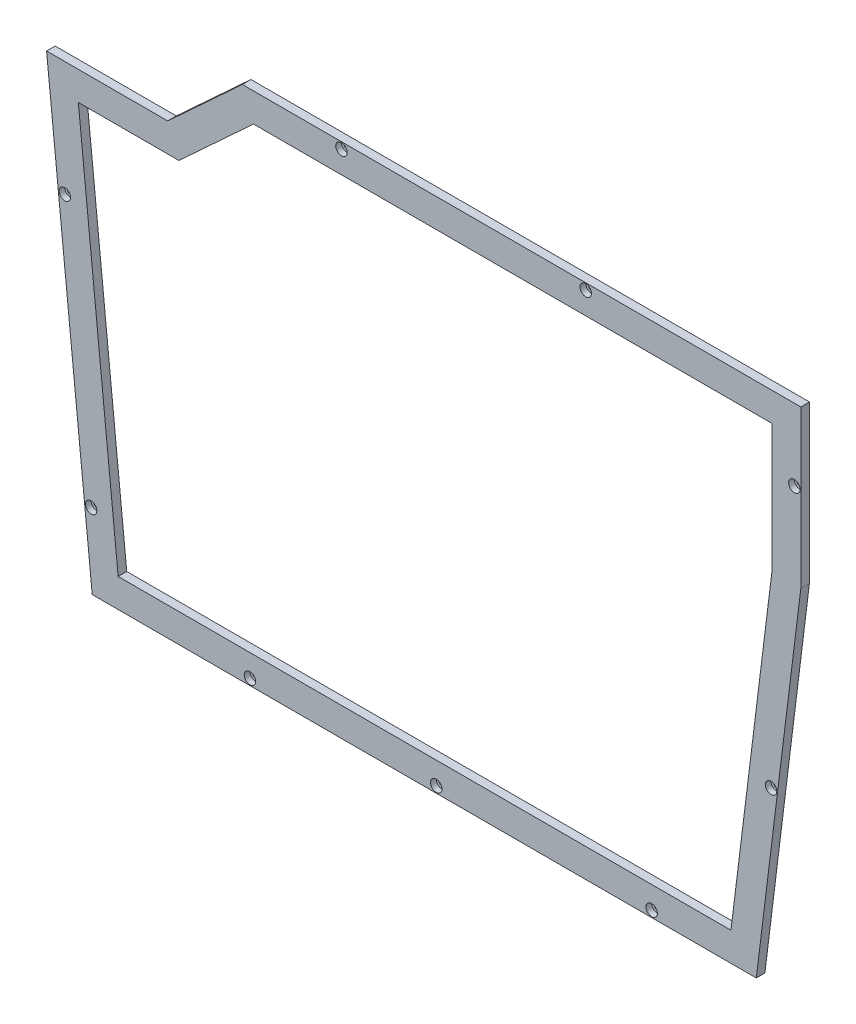
ISO-10303-21;
HEADER;
FILE_DESCRIPTION(('STEP AP214'),'2;1');
FILE_NAME('part.step','',(''),(''),'','','');
FILE_SCHEMA(('AUTOMOTIVE_DESIGN { 1 0 10303 214 1 1 1 1 }'));
ENDSEC;
DATA;
#1=APPLICATION_CONTEXT('core data for automotive mechanical design processes');
#2=APPLICATION_PROTOCOL_DEFINITION('international standard','automotive_design',2000,#1);
#3=PRODUCT_CONTEXT('',#1,'mechanical');
#4=PRODUCT('Part','Part','',(#3));
#5=PRODUCT_RELATED_PRODUCT_CATEGORY('part','',(#4));
#6=PRODUCT_DEFINITION_FORMATION('','',#4);
#7=PRODUCT_DEFINITION_CONTEXT('part definition',#1,'design');
#8=PRODUCT_DEFINITION('design','',#6,#7);
#9=PRODUCT_DEFINITION_SHAPE('','',#8);
#10=(LENGTH_UNIT() NAMED_UNIT(*) SI_UNIT(.MILLI.,.METRE.));
#11=(NAMED_UNIT(*) PLANE_ANGLE_UNIT() SI_UNIT($,.RADIAN.));
#12=(NAMED_UNIT(*) SI_UNIT($,.STERADIAN.) SOLID_ANGLE_UNIT());
#13=UNCERTAINTY_MEASURE_WITH_UNIT(LENGTH_MEASURE(1.E-05),#10,'distance_accuracy_value','');
#14=(GEOMETRIC_REPRESENTATION_CONTEXT(3) GLOBAL_UNCERTAINTY_ASSIGNED_CONTEXT((#13)) GLOBAL_UNIT_ASSIGNED_CONTEXT((#10,
#11,#12)) REPRESENTATION_CONTEXT('',''));
#15=CARTESIAN_POINT('',(0.,0.,0.));
#16=DIRECTION('',(0.,0.,1.));
#17=DIRECTION('',(1.,0.,0.));
#18=AXIS2_PLACEMENT_3D('',#15,#16,#17);
#19=CARTESIAN_POINT('',(0.,0.,6.));
#20=DIRECTION('',(0.,0.,-1.));
#21=DIRECTION('',(-1.,0.,0.));
#22=AXIS2_PLACEMENT_3D('',#19,#20,#21);
#23=PLANE('',#22);
#24=CARTESIAN_POINT('',(1.72669205479839,-145.122614110825,6.));
#25=DIRECTION('',(0.,0.,1.));
#26=DIRECTION('',(1.,0.,0.));
#27=AXIS2_PLACEMENT_3D('',#24,#25,#26);
#28=CIRCLE('',#27,3.99999999999999);
#29=CARTESIAN_POINT('',(5.72669205479838,-145.122614110825,6.));
#30=VERTEX_POINT('',#29);
#31=EDGE_CURVE('E643',#30,#30,#28,.T.);
#32=ORIENTED_EDGE('',*,*,#31,.F.);
#33=EDGE_LOOP('',(#32));
#34=FACE_BOUND('',#33,.T.);
#35=CARTESIAN_POINT('',(20.0680254489332,-325.051094707287,6.));
#36=DIRECTION('',(0.,0.,1.));
#37=DIRECTION('',(1.,0.,0.));
#38=AXIS2_PLACEMENT_3D('',#35,#36,#37);
#39=CIRCLE('',#38,3.99999999999999);
#40=CARTESIAN_POINT('',(24.0680254489332,-325.051094707287,6.));
#41=VERTEX_POINT('',#40);
#42=EDGE_CURVE('E289',#41,#41,#39,.T.);
#43=ORIENTED_EDGE('',*,*,#42,.F.);
#44=EDGE_LOOP('',(#43));
#45=FACE_BOUND('',#44,.T.);
#46=CARTESIAN_POINT('',(130.819543847785,-372.8,6.));
#47=DIRECTION('',(0.,0.,1.));
#48=DIRECTION('',(1.,0.,0.));
#49=AXIS2_PLACEMENT_3D('',#46,#47,#48);
#50=CIRCLE('',#49,4.);
#51=CARTESIAN_POINT('',(134.819543847785,-372.8,6.));
#52=VERTEX_POINT('',#51);
#53=EDGE_CURVE('E276',#52,#52,#50,.T.);
#54=ORIENTED_EDGE('',*,*,#53,.F.);
#55=EDGE_LOOP('',(#54));
#56=FACE_BOUND('',#55,.T.);
#57=CARTESIAN_POINT('',(260.695946351952,-372.8,6.));
#58=DIRECTION('',(0.,0.,1.));
#59=DIRECTION('',(1.,0.,0.));
#60=AXIS2_PLACEMENT_3D('',#57,#58,#59);
#61=CIRCLE('',#60,4.);
#62=CARTESIAN_POINT('',(264.695946351952,-372.8,6.));
#63=VERTEX_POINT('',#62);
#64=EDGE_CURVE('E272',#63,#63,#61,.T.);
#65=ORIENTED_EDGE('',*,*,#64,.F.);
#66=EDGE_LOOP('',(#65));
#67=FACE_BOUND('',#66,.T.);
#68=CARTESIAN_POINT('',(410.870792038076,-372.8,6.));
#69=DIRECTION('',(0.,0.,1.));
#70=DIRECTION('',(1.,0.,0.));
#71=AXIS2_PLACEMENT_3D('',#68,#69,#70);
#72=CIRCLE('',#71,4.);
#73=CARTESIAN_POINT('',(414.870792038076,-372.8,6.));
#74=VERTEX_POINT('',#73);
#75=EDGE_CURVE('E268',#74,#74,#72,.T.);
#76=ORIENTED_EDGE('',*,*,#75,.F.);
#77=EDGE_LOOP('',(#76));
#78=FACE_BOUND('',#77,.T.);
#79=CARTESIAN_POINT('',(494.109580684271,-257.391480805223,6.));
#80=DIRECTION('',(0.,0.,1.));
#81=DIRECTION('',(1.,0.,0.));
#82=AXIS2_PLACEMENT_3D('',#79,#80,#81);
#83=CIRCLE('',#82,4.);
#84=CARTESIAN_POINT('',(498.109580684271,-257.391480805223,6.));
#85=VERTEX_POINT('',#84);
#86=EDGE_CURVE('E263',#85,#85,#83,.T.);
#87=ORIENTED_EDGE('',*,*,#86,.F.);
#88=EDGE_LOOP('',(#87));
#89=FACE_BOUND('',#88,.T.);
#90=CARTESIAN_POINT('',(510.343252999998,-67.0320824467655,6.));
#91=DIRECTION('',(0.,0.,1.));
#92=DIRECTION('',(1.,0.,0.));
#93=AXIS2_PLACEMENT_3D('',#90,#91,#92);
#94=CIRCLE('',#93,4.);
#95=CARTESIAN_POINT('',(514.343252999998,-67.0320824467655,6.));
#96=VERTEX_POINT('',#95);
#97=EDGE_CURVE('E258',#96,#96,#94,.T.);
#98=ORIENTED_EDGE('',*,*,#97,.F.);
#99=EDGE_LOOP('',(#98));
#100=FACE_BOUND('',#99,.T.);
#101=CARTESIAN_POINT('',(364.912339867024,-21.5,6.));
#102=DIRECTION('',(0.,0.,1.));
#103=DIRECTION('',(1.,0.,0.));
#104=AXIS2_PLACEMENT_3D('',#101,#102,#103);
#105=CIRCLE('',#104,4.);
#106=CARTESIAN_POINT('',(368.912339867024,-21.5,6.));
#107=VERTEX_POINT('',#106);
#108=EDGE_CURVE('E253',#107,#107,#105,.T.);
#109=ORIENTED_EDGE('',*,*,#108,.F.);
#110=EDGE_LOOP('',(#109));
#111=FACE_BOUND('',#110,.T.);
#112=CARTESIAN_POINT('',(194.606610563881,-21.5,6.));
#113=DIRECTION('',(0.,0.,1.));
#114=DIRECTION('',(1.,0.,0.));
#115=AXIS2_PLACEMENT_3D('',#112,#113,#114);
#116=CIRCLE('',#115,4.);
#117=CARTESIAN_POINT('',(198.606610563881,-21.5,6.));
#118=VERTEX_POINT('',#117);
#119=EDGE_CURVE('E248',#118,#118,#116,.T.);
#120=ORIENTED_EDGE('',*,*,#119,.F.);
#121=EDGE_LOOP('',(#120));
#122=FACE_BOUND('',#121,.T.);
#123=DIRECTION('',(-1.,0.,0.));
#124=VECTOR('',#123,1.);
#125=CARTESIAN_POINT('',(73.4811454902829,-64.9999999999999,6.));
#126=LINE('',#125,#124);
#127=CARTESIAN_POINT('',(73.4811454902829,-64.9999999999999,6.));
#128=VERTEX_POINT('',#127);
#129=CARTESIAN_POINT('',(-10.9640703472468,-64.9999999999999,6.));
#130=VERTEX_POINT('',#129);
#131=EDGE_CURVE('E196',#128,#130,#126,.T.);
#132=ORIENTED_EDGE('',*,*,#131,.T.);
#133=DIRECTION('',(0.101411272958268,-0.994844587720607,0.));
#134=VECTOR('',#133,1.);
#135=CARTESIAN_POINT('',(-10.9640703472468,-64.9999999999999,6.));
#136=LINE('',#135,#134);
#137=CARTESIAN_POINT('',(20.8707920380743,-377.3,6.));
#138=VERTEX_POINT('',#137);
#139=EDGE_CURVE('E199',#130,#138,#136,.T.);
#140=ORIENTED_EDGE('',*,*,#139,.T.);
#141=DIRECTION('',(1.,0.,0.));
#142=VECTOR('',#141,1.);
#143=CARTESIAN_POINT('',(20.8707920380743,-377.3,6.));
#144=LINE('',#143,#142);
#145=CARTESIAN_POINT('',(483.797653512222,-377.3,6.));
#146=VERTEX_POINT('',#145);
#147=EDGE_CURVE('E202',#138,#146,#144,.T.);
#148=ORIENTED_EDGE('',*,*,#147,.T.);
#149=DIRECTION('',(0.12287521201879,0.992422129071766,0.));
#150=VECTOR('',#149,1.);
#151=CARTESIAN_POINT('',(483.797653512222,-377.3,6.));
#152=LINE('',#151,#150);
#153=CARTESIAN_POINT('',(514.843252999998,-126.555041470395,6.));
#154=VERTEX_POINT('',#153);
#155=EDGE_CURVE('E204',#146,#154,#152,.T.);
#156=ORIENTED_EDGE('',*,*,#155,.T.);
#157=DIRECTION('',(0.,1.,0.));
#158=VECTOR('',#157,1.);
#159=CARTESIAN_POINT('',(514.843252999998,-126.555041470395,6.));
#160=LINE('',#159,#158);
#161=CARTESIAN_POINT('',(514.843252999998,-17.,6.));
#162=VERTEX_POINT('',#161);
#163=EDGE_CURVE('E206',#154,#162,#160,.T.);
#164=ORIENTED_EDGE('',*,*,#163,.T.);
#165=DIRECTION('',(-1.,0.,0.));
#166=VECTOR('',#165,1.);
#167=CARTESIAN_POINT('',(514.843252999998,-17.,6.));
#168=LINE('',#167,#166);
#169=CARTESIAN_POINT('',(125.481145490283,-17.,6.));
#170=VERTEX_POINT('',#169);
#171=EDGE_CURVE('E208',#162,#170,#168,.T.);
#172=ORIENTED_EDGE('',*,*,#171,.T.);
#173=DIRECTION('',(-0.734803444627488,-0.678280102733065,0.));
#174=VECTOR('',#173,1.);
#175=CARTESIAN_POINT('',(125.481145490283,-17.,6.));
#176=LINE('',#175,#174);
#177=EDGE_CURVE('E210',#170,#128,#176,.T.);
#178=ORIENTED_EDGE('',*,*,#177,.T.);
#179=EDGE_LOOP('',(#132,#140,#148,#156,#164,#172,#178));
#180=FACE_BOUND('',#179,.T.);
#181=DIRECTION('',(-1.,0.,0.));
#182=VECTOR('',#181,1.);
#183=CARTESIAN_POINT('',(81.3008221785398,-84.9999999999999,6.));
#184=LINE('',#183,#182);
#185=CARTESIAN_POINT('',(81.3008221785398,-84.9999999999999,6.));
#186=VERTEX_POINT('',#185);
#187=CARTESIAN_POINT('',(11.1783082021873,-84.9999999999999,6.));
#188=VERTEX_POINT('',#187);
#189=EDGE_CURVE('E136',#186,#188,#184,.T.);
#190=ORIENTED_EDGE('',*,*,#189,.F.);
#191=DIRECTION('',(-0.734803444627488,-0.678280102733065,0.));
#192=VECTOR('',#191,1.);
#193=CARTESIAN_POINT('',(133.30082217854,-37.,6.));
#194=LINE('',#193,#192);
#195=CARTESIAN_POINT('',(133.30082217854,-37.,6.));
#196=VERTEX_POINT('',#195);
#197=EDGE_CURVE('E168',#196,#186,#194,.T.);
#198=ORIENTED_EDGE('',*,*,#197,.F.);
#199=DIRECTION('',(-1.,0.,0.));
#200=VECTOR('',#199,1.);
#201=CARTESIAN_POINT('',(494.843252999998,-37.,6.));
#202=LINE('',#201,#200);
#203=CARTESIAN_POINT('',(494.843252999998,-37.,6.));
#204=VERTEX_POINT('',#203);
#205=EDGE_CURVE('E166',#204,#196,#202,.T.);
#206=ORIENTED_EDGE('',*,*,#205,.F.);
#207=DIRECTION('',(0.,1.,0.));
#208=VECTOR('',#207,1.);
#209=CARTESIAN_POINT('',(494.843252999998,-125.321615980626,6.));
#210=LINE('',#209,#208);
#211=CARTESIAN_POINT('',(494.843252999998,-125.321615980626,6.));
#212=VERTEX_POINT('',#211);
#213=EDGE_CURVE('E164',#212,#204,#210,.T.);
#214=ORIENTED_EDGE('',*,*,#213,.F.);
#215=DIRECTION('',(0.12287521201879,0.992422129071766,0.));
#216=VECTOR('',#215,1.);
#217=CARTESIAN_POINT('',(466.121207929502,-357.3,6.));
#218=LINE('',#217,#216);
#219=CARTESIAN_POINT('',(466.121207929502,-357.3,6.));
#220=VERTEX_POINT('',#219);
#221=EDGE_CURVE('E159',#220,#212,#218,.T.);
#222=ORIENTED_EDGE('',*,*,#221,.F.);
#223=DIRECTION('',(1.,0.,0.));
#224=VECTOR('',#223,1.);
#225=CARTESIAN_POINT('',(38.9356986201281,-357.3,6.));
#226=LINE('',#225,#224);
#227=CARTESIAN_POINT('',(38.9356986201281,-357.3,6.));
#228=VERTEX_POINT('',#227);
#229=EDGE_CURVE('E157',#228,#220,#226,.T.);
#230=ORIENTED_EDGE('',*,*,#229,.F.);
#231=DIRECTION('',(0.101411272958268,-0.994844587720606,0.));
#232=VECTOR('',#231,1.);
#233=CARTESIAN_POINT('',(11.1783082021873,-84.9999999999999,6.));
#234=LINE('',#233,#232);
#235=EDGE_CURVE('E144',#188,#228,#234,.T.);
#236=ORIENTED_EDGE('',*,*,#235,.F.);
#237=EDGE_LOOP('',(#190,#198,#206,#214,#222,#230,#236));
#238=FACE_BOUND('',#237,.T.);
#239=ADVANCED_FACE('F33',(#34,#45,#56,#67,#78,#89,#100,#111,#122,#180,#238),#23,.F.);
#240=CARTESIAN_POINT('',(0.,0.,0.));
#241=DIRECTION('',(0.,0.,-1.));
#242=DIRECTION('',(-1.,0.,0.));
#243=AXIS2_PLACEMENT_3D('',#240,#241,#242);
#244=PLANE('',#243);
#245=CARTESIAN_POINT('',(1.72669205479839,-145.122614110825,0.));
#246=DIRECTION('',(0.,0.,-1.));
#247=DIRECTION('',(-1.,0.,0.));
#248=AXIS2_PLACEMENT_3D('',#245,#246,#247);
#249=CIRCLE('',#248,2.15);
#250=CARTESIAN_POINT('',(-0.42330794520161,-145.122614110825,0.));
#251=VERTEX_POINT('',#250);
#252=EDGE_CURVE('E37',#251,#251,#249,.T.);
#253=ORIENTED_EDGE('',*,*,#252,.F.);
#254=EDGE_LOOP('',(#253));
#255=FACE_BOUND('',#254,.T.);
#256=CARTESIAN_POINT('',(20.0680254489332,-325.051094707287,0.));
#257=DIRECTION('',(0.,0.,-1.));
#258=DIRECTION('',(-1.,0.,0.));
#259=AXIS2_PLACEMENT_3D('',#256,#257,#258);
#260=CIRCLE('',#259,2.15);
#261=CARTESIAN_POINT('',(17.9180254489332,-325.051094707287,0.));
#262=VERTEX_POINT('',#261);
#263=EDGE_CURVE('E274',#262,#262,#260,.T.);
#264=ORIENTED_EDGE('',*,*,#263,.F.);
#265=EDGE_LOOP('',(#264));
#266=FACE_BOUND('',#265,.T.);
#267=CARTESIAN_POINT('',(130.819543847785,-372.8,0.));
#268=DIRECTION('',(0.,0.,-1.));
#269=DIRECTION('',(-1.,0.,0.));
#270=AXIS2_PLACEMENT_3D('',#267,#268,#269);
#271=CIRCLE('',#270,2.15);
#272=CARTESIAN_POINT('',(128.669543847785,-372.8,0.));
#273=VERTEX_POINT('',#272);
#274=EDGE_CURVE('E270',#273,#273,#271,.T.);
#275=ORIENTED_EDGE('',*,*,#274,.F.);
#276=EDGE_LOOP('',(#275));
#277=FACE_BOUND('',#276,.T.);
#278=CARTESIAN_POINT('',(260.695946351952,-372.8,0.));
#279=DIRECTION('',(0.,0.,-1.));
#280=DIRECTION('',(-1.,0.,0.));
#281=AXIS2_PLACEMENT_3D('',#278,#279,#280);
#282=CIRCLE('',#281,2.14999999999999);
#283=CARTESIAN_POINT('',(258.545946351952,-372.8,0.));
#284=VERTEX_POINT('',#283);
#285=EDGE_CURVE('E265',#284,#284,#282,.T.);
#286=ORIENTED_EDGE('',*,*,#285,.F.);
#287=EDGE_LOOP('',(#286));
#288=FACE_BOUND('',#287,.T.);
#289=CARTESIAN_POINT('',(410.870792038076,-372.8,0.));
#290=DIRECTION('',(0.,0.,-1.));
#291=DIRECTION('',(-1.,0.,0.));
#292=AXIS2_PLACEMENT_3D('',#289,#290,#291);
#293=CIRCLE('',#292,2.14999999999999);
#294=CARTESIAN_POINT('',(408.720792038076,-372.8,0.));
#295=VERTEX_POINT('',#294);
#296=EDGE_CURVE('E260',#295,#295,#293,.T.);
#297=ORIENTED_EDGE('',*,*,#296,.F.);
#298=EDGE_LOOP('',(#297));
#299=FACE_BOUND('',#298,.T.);
#300=CARTESIAN_POINT('',(494.109580684271,-257.391480805223,0.));
#301=DIRECTION('',(0.,0.,-1.));
#302=DIRECTION('',(-1.,0.,0.));
#303=AXIS2_PLACEMENT_3D('',#300,#301,#302);
#304=CIRCLE('',#303,2.14999999999999);
#305=CARTESIAN_POINT('',(491.959580684271,-257.391480805223,0.));
#306=VERTEX_POINT('',#305);
#307=EDGE_CURVE('E255',#306,#306,#304,.T.);
#308=ORIENTED_EDGE('',*,*,#307,.F.);
#309=EDGE_LOOP('',(#308));
#310=FACE_BOUND('',#309,.T.);
#311=CARTESIAN_POINT('',(510.343252999998,-67.0320824467655,0.));
#312=DIRECTION('',(0.,0.,-1.));
#313=DIRECTION('',(-1.,0.,0.));
#314=AXIS2_PLACEMENT_3D('',#311,#312,#313);
#315=CIRCLE('',#314,2.14999999999999);
#316=CARTESIAN_POINT('',(508.193252999998,-67.0320824467655,0.));
#317=VERTEX_POINT('',#316);
#318=EDGE_CURVE('E250',#317,#317,#315,.T.);
#319=ORIENTED_EDGE('',*,*,#318,.F.);
#320=EDGE_LOOP('',(#319));
#321=FACE_BOUND('',#320,.T.);
#322=CARTESIAN_POINT('',(364.912339867024,-21.5,0.));
#323=DIRECTION('',(0.,0.,-1.));
#324=DIRECTION('',(-1.,0.,0.));
#325=AXIS2_PLACEMENT_3D('',#322,#323,#324);
#326=CIRCLE('',#325,2.14999999999999);
#327=CARTESIAN_POINT('',(362.762339867024,-21.5,0.));
#328=VERTEX_POINT('',#327);
#329=EDGE_CURVE('E245',#328,#328,#326,.T.);
#330=ORIENTED_EDGE('',*,*,#329,.F.);
#331=EDGE_LOOP('',(#330));
#332=FACE_BOUND('',#331,.T.);
#333=CARTESIAN_POINT('',(194.606610563881,-21.5,0.));
#334=DIRECTION('',(0.,0.,-1.));
#335=DIRECTION('',(-1.,0.,0.));
#336=AXIS2_PLACEMENT_3D('',#333,#334,#335);
#337=CIRCLE('',#336,2.15);
#338=CARTESIAN_POINT('',(192.456610563881,-21.5,0.));
#339=VERTEX_POINT('',#338);
#340=EDGE_CURVE('E171',#339,#339,#337,.T.);
#341=ORIENTED_EDGE('',*,*,#340,.F.);
#342=EDGE_LOOP('',(#341));
#343=FACE_BOUND('',#342,.T.);
#344=DIRECTION('',(-1.,0.,0.));
#345=VECTOR('',#344,1.);
#346=CARTESIAN_POINT('',(73.4811454902829,-64.9999999999999,0.));
#347=LINE('',#346,#345);
#348=CARTESIAN_POINT('',(73.4811454902829,-64.9999999999999,0.));
#349=VERTEX_POINT('',#348);
#350=CARTESIAN_POINT('',(-10.9640703472468,-64.9999999999999,0.));
#351=VERTEX_POINT('',#350);
#352=EDGE_CURVE('E152',#349,#351,#347,.T.);
#353=ORIENTED_EDGE('',*,*,#352,.F.);
#354=DIRECTION('',(-0.734803444627488,-0.678280102733065,0.));
#355=VECTOR('',#354,1.);
#356=CARTESIAN_POINT('',(125.481145490283,-17.,0.));
#357=LINE('',#356,#355);
#358=CARTESIAN_POINT('',(125.481145490283,-17.,0.));
#359=VERTEX_POINT('',#358);
#360=EDGE_CURVE('E200',#359,#349,#357,.T.);
#361=ORIENTED_EDGE('',*,*,#360,.F.);
#362=DIRECTION('',(-1.,0.,0.));
#363=VECTOR('',#362,1.);
#364=CARTESIAN_POINT('',(514.843252999998,-17.,0.));
#365=LINE('',#364,#363);
#366=CARTESIAN_POINT('',(514.843252999998,-17.,0.));
#367=VERTEX_POINT('',#366);
#368=EDGE_CURVE('E223',#367,#359,#365,.T.);
#369=ORIENTED_EDGE('',*,*,#368,.F.);
#370=DIRECTION('',(0.,1.,0.));
#371=VECTOR('',#370,1.);
#372=CARTESIAN_POINT('',(514.843252999998,-126.555041470395,0.));
#373=LINE('',#372,#371);
#374=CARTESIAN_POINT('',(514.843252999998,-126.555041470395,0.));
#375=VERTEX_POINT('',#374);
#376=EDGE_CURVE('E221',#375,#367,#373,.T.);
#377=ORIENTED_EDGE('',*,*,#376,.F.);
#378=DIRECTION('',(0.12287521201879,0.992422129071766,0.));
#379=VECTOR('',#378,1.);
#380=CARTESIAN_POINT('',(483.797653512222,-377.3,0.));
#381=LINE('',#380,#379);
#382=CARTESIAN_POINT('',(483.797653512222,-377.3,0.));
#383=VERTEX_POINT('',#382);
#384=EDGE_CURVE('E219',#383,#375,#381,.T.);
#385=ORIENTED_EDGE('',*,*,#384,.F.);
#386=DIRECTION('',(1.,0.,0.));
#387=VECTOR('',#386,1.);
#388=CARTESIAN_POINT('',(20.8707920380743,-377.3,0.));
#389=LINE('',#388,#387);
#390=CARTESIAN_POINT('',(20.8707920380743,-377.3,0.));
#391=VERTEX_POINT('',#390);
#392=EDGE_CURVE('E217',#391,#383,#389,.T.);
#393=ORIENTED_EDGE('',*,*,#392,.F.);
#394=DIRECTION('',(0.101411272958268,-0.994844587720607,0.));
#395=VECTOR('',#394,1.);
#396=CARTESIAN_POINT('',(-10.9640703472468,-64.9999999999999,0.));
#397=LINE('',#396,#395);
#398=EDGE_CURVE('E215',#351,#391,#397,.T.);
#399=ORIENTED_EDGE('',*,*,#398,.F.);
#400=EDGE_LOOP('',(#353,#361,#369,#377,#385,#393,#399));
#401=FACE_BOUND('',#400,.T.);
#402=DIRECTION('',(-0.734803444627488,-0.678280102733065,0.));
#403=VECTOR('',#402,1.);
#404=CARTESIAN_POINT('',(133.30082217854,-37.,0.));
#405=LINE('',#404,#403);
#406=CARTESIAN_POINT('',(133.30082217854,-37.,0.));
#407=VERTEX_POINT('',#406);
#408=CARTESIAN_POINT('',(81.3008221785398,-84.9999999999999,0.));
#409=VERTEX_POINT('',#408);
#410=EDGE_CURVE('E145',#407,#409,#405,.T.);
#411=ORIENTED_EDGE('',*,*,#410,.T.);
#412=DIRECTION('',(-1.,0.,0.));
#413=VECTOR('',#412,1.);
#414=CARTESIAN_POINT('',(81.3008221785398,-84.9999999999999,0.));
#415=LINE('',#414,#413);
#416=CARTESIAN_POINT('',(11.1783082021873,-84.9999999999999,0.));
#417=VERTEX_POINT('',#416);
#418=EDGE_CURVE('E58',#409,#417,#415,.T.);
#419=ORIENTED_EDGE('',*,*,#418,.T.);
#420=DIRECTION('',(0.101411272958268,-0.994844587720606,0.));
#421=VECTOR('',#420,1.);
#422=CARTESIAN_POINT('',(11.1783082021873,-84.9999999999999,0.));
#423=LINE('',#422,#421);
#424=CARTESIAN_POINT('',(38.9356986201281,-357.3,0.));
#425=VERTEX_POINT('',#424);
#426=EDGE_CURVE('E151',#417,#425,#423,.T.);
#427=ORIENTED_EDGE('',*,*,#426,.T.);
#428=DIRECTION('',(1.,0.,0.));
#429=VECTOR('',#428,1.);
#430=CARTESIAN_POINT('',(38.9356986201281,-357.3,0.));
#431=LINE('',#430,#429);
#432=CARTESIAN_POINT('',(466.121207929502,-357.3,0.));
#433=VERTEX_POINT('',#432);
#434=EDGE_CURVE('E173',#425,#433,#431,.T.);
#435=ORIENTED_EDGE('',*,*,#434,.T.);
#436=DIRECTION('',(0.12287521201879,0.992422129071766,0.));
#437=VECTOR('',#436,1.);
#438=CARTESIAN_POINT('',(466.121207929502,-357.3,0.));
#439=LINE('',#438,#437);
#440=CARTESIAN_POINT('',(494.843252999998,-125.321615980626,0.));
#441=VERTEX_POINT('',#440);
#442=EDGE_CURVE('E176',#433,#441,#439,.T.);
#443=ORIENTED_EDGE('',*,*,#442,.T.);
#444=DIRECTION('',(0.,1.,0.));
#445=VECTOR('',#444,1.);
#446=CARTESIAN_POINT('',(494.843252999998,-125.321615980626,0.));
#447=LINE('',#446,#445);
#448=CARTESIAN_POINT('',(494.843252999998,-37.,0.));
#449=VERTEX_POINT('',#448);
#450=EDGE_CURVE('E179',#441,#449,#447,.T.);
#451=ORIENTED_EDGE('',*,*,#450,.T.);
#452=DIRECTION('',(-1.,0.,0.));
#453=VECTOR('',#452,1.);
#454=CARTESIAN_POINT('',(494.843252999998,-37.,0.));
#455=LINE('',#454,#453);
#456=EDGE_CURVE('E182',#449,#407,#455,.T.);
#457=ORIENTED_EDGE('',*,*,#456,.T.);
#458=EDGE_LOOP('',(#411,#419,#427,#435,#443,#451,#457));
#459=FACE_BOUND('',#458,.T.);
#460=ADVANCED_FACE('F356',(#255,#266,#277,#288,#299,#310,#321,#332,#343,#401,#459),#244,.T.);
#461=CARTESIAN_POINT('',(73.4811454902829,-64.9999999999999,6.));
#462=DIRECTION('',(0.,-1.,0.));
#463=DIRECTION('',(1.,0.,0.));
#464=AXIS2_PLACEMENT_3D('',#461,#462,#463);
#465=PLANE('',#464);
#466=ORIENTED_EDGE('',*,*,#352,.T.);
#467=DIRECTION('',(0.,0.,-1.));
#468=VECTOR('',#467,1.);
#469=CARTESIAN_POINT('',(-10.9640703472468,-64.9999999999999,6.));
#470=LINE('',#469,#468);
#471=EDGE_CURVE('E11',#130,#351,#470,.T.);
#472=ORIENTED_EDGE('',*,*,#471,.F.);
#473=ORIENTED_EDGE('',*,*,#131,.F.);
#474=DIRECTION('',(0.,0.,-1.));
#475=VECTOR('',#474,1.);
#476=CARTESIAN_POINT('',(73.4811454902829,-64.9999999999999,6.));
#477=LINE('',#476,#475);
#478=EDGE_CURVE('E212',#128,#349,#477,.T.);
#479=ORIENTED_EDGE('',*,*,#478,.T.);
#480=EDGE_LOOP('',(#466,#472,#473,#479));
#481=FACE_BOUND('',#480,.T.);
#482=ADVANCED_FACE('F35',(#481),#465,.F.);
#483=CARTESIAN_POINT('',(-10.9640703472468,-64.9999999999999,6.));
#484=DIRECTION('',(0.994844587720606,0.101411272958268,0.));
#485=DIRECTION('',(-0.101411272958268,0.994844587720607,0.));
#486=AXIS2_PLACEMENT_3D('',#483,#484,#485);
#487=PLANE('',#486);
#488=ORIENTED_EDGE('',*,*,#398,.T.);
#489=DIRECTION('',(0.,0.,-1.));
#490=VECTOR('',#489,1.);
#491=CARTESIAN_POINT('',(20.8707920380743,-377.3,6.));
#492=LINE('',#491,#490);
#493=EDGE_CURVE('E42',#138,#391,#492,.T.);
#494=ORIENTED_EDGE('',*,*,#493,.F.);
#495=ORIENTED_EDGE('',*,*,#139,.F.);
#496=ORIENTED_EDGE('',*,*,#471,.T.);
#497=EDGE_LOOP('',(#488,#494,#495,#496));
#498=FACE_BOUND('',#497,.T.);
#499=ADVANCED_FACE('F367',(#498),#487,.F.);
#500=CARTESIAN_POINT('',(20.8707920380743,-377.3,6.));
#501=DIRECTION('',(0.,1.,0.));
#502=DIRECTION('',(-1.,0.,0.));
#503=AXIS2_PLACEMENT_3D('',#500,#501,#502);
#504=PLANE('',#503);
#505=ORIENTED_EDGE('',*,*,#392,.T.);
#506=DIRECTION('',(0.,0.,-1.));
#507=VECTOR('',#506,1.);
#508=CARTESIAN_POINT('',(483.797653512222,-377.3,6.));
#509=LINE('',#508,#507);
#510=EDGE_CURVE('E237',#146,#383,#509,.T.);
#511=ORIENTED_EDGE('',*,*,#510,.F.);
#512=ORIENTED_EDGE('',*,*,#147,.F.);
#513=ORIENTED_EDGE('',*,*,#493,.T.);
#514=EDGE_LOOP('',(#505,#511,#512,#513));
#515=FACE_BOUND('',#514,.T.);
#516=ADVANCED_FACE('F372',(#515),#504,.F.);
#517=CARTESIAN_POINT('',(483.797653512222,-377.3,6.));
#518=DIRECTION('',(-0.992422129071766,0.12287521201879,0.));
#519=DIRECTION('',(-0.12287521201879,-0.992422129071766,0.));
#520=AXIS2_PLACEMENT_3D('',#517,#518,#519);
#521=PLANE('',#520);
#522=ORIENTED_EDGE('',*,*,#384,.T.);
#523=DIRECTION('',(0.,0.,-1.));
#524=VECTOR('',#523,1.);
#525=CARTESIAN_POINT('',(514.843252999998,-126.555041470395,6.));
#526=LINE('',#525,#524);
#527=EDGE_CURVE('E234',#154,#375,#526,.T.);
#528=ORIENTED_EDGE('',*,*,#527,.F.);
#529=ORIENTED_EDGE('',*,*,#155,.F.);
#530=ORIENTED_EDGE('',*,*,#510,.T.);
#531=EDGE_LOOP('',(#522,#528,#529,#530));
#532=FACE_BOUND('',#531,.T.);
#533=ADVANCED_FACE('F378',(#532),#521,.F.);
#534=CARTESIAN_POINT('',(514.843252999998,-126.555041470395,6.));
#535=DIRECTION('',(-1.,0.,0.));
#536=DIRECTION('',(0.,0.,1.));
#537=AXIS2_PLACEMENT_3D('',#534,#535,#536);
#538=PLANE('',#537);
#539=ORIENTED_EDGE('',*,*,#376,.T.);
#540=DIRECTION('',(0.,0.,-1.));
#541=VECTOR('',#540,1.);
#542=CARTESIAN_POINT('',(514.843252999998,-17.,6.));
#543=LINE('',#542,#541);
#544=EDGE_CURVE('E231',#162,#367,#543,.T.);
#545=ORIENTED_EDGE('',*,*,#544,.F.);
#546=ORIENTED_EDGE('',*,*,#163,.F.);
#547=ORIENTED_EDGE('',*,*,#527,.T.);
#548=EDGE_LOOP('',(#539,#545,#546,#547));
#549=FACE_BOUND('',#548,.T.);
#550=ADVANCED_FACE('F382',(#549),#538,.F.);
#551=CARTESIAN_POINT('',(514.843252999998,-17.,6.));
#552=DIRECTION('',(0.,-1.,0.));
#553=DIRECTION('',(1.,0.,0.));
#554=AXIS2_PLACEMENT_3D('',#551,#552,#553);
#555=PLANE('',#554);
#556=ORIENTED_EDGE('',*,*,#368,.T.);
#557=DIRECTION('',(0.,0.,-1.));
#558=VECTOR('',#557,1.);
#559=CARTESIAN_POINT('',(125.481145490283,-17.,6.));
#560=LINE('',#559,#558);
#561=EDGE_CURVE('E228',#170,#359,#560,.T.);
#562=ORIENTED_EDGE('',*,*,#561,.F.);
#563=ORIENTED_EDGE('',*,*,#171,.F.);
#564=ORIENTED_EDGE('',*,*,#544,.T.);
#565=EDGE_LOOP('',(#556,#562,#563,#564));
#566=FACE_BOUND('',#565,.T.);
#567=ADVANCED_FACE('F387',(#566),#555,.F.);
#568=CARTESIAN_POINT('',(125.481145490283,-17.,6.));
#569=DIRECTION('',(0.678280102733065,-0.734803444627488,0.));
#570=DIRECTION('',(0.734803444627488,0.678280102733065,0.));
#571=AXIS2_PLACEMENT_3D('',#568,#569,#570);
#572=PLANE('',#571);
#573=ORIENTED_EDGE('',*,*,#360,.T.);
#574=ORIENTED_EDGE('',*,*,#478,.F.);
#575=ORIENTED_EDGE('',*,*,#177,.F.);
#576=ORIENTED_EDGE('',*,*,#561,.T.);
#577=EDGE_LOOP('',(#573,#574,#575,#576));
#578=FACE_BOUND('',#577,.T.);
#579=ADVANCED_FACE('F390',(#578),#572,.F.);
#580=CARTESIAN_POINT('',(81.3008221785398,-84.9999999999999,6.));
#581=DIRECTION('',(0.,-1.,0.));
#582=DIRECTION('',(1.,0.,0.));
#583=AXIS2_PLACEMENT_3D('',#580,#581,#582);
#584=PLANE('',#583);
#585=ORIENTED_EDGE('',*,*,#418,.F.);
#586=DIRECTION('',(0.,0.,-1.));
#587=VECTOR('',#586,1.);
#588=CARTESIAN_POINT('',(81.3008221785398,-84.9999999999999,6.));
#589=LINE('',#588,#587);
#590=EDGE_CURVE('E140',#186,#409,#589,.T.);
#591=ORIENTED_EDGE('',*,*,#590,.F.);
#592=ORIENTED_EDGE('',*,*,#189,.T.);
#593=DIRECTION('',(0.,0.,-1.));
#594=VECTOR('',#593,1.);
#595=CARTESIAN_POINT('',(11.1783082021873,-84.9999999999999,6.));
#596=LINE('',#595,#594);
#597=EDGE_CURVE('E139',#188,#417,#596,.T.);
#598=ORIENTED_EDGE('',*,*,#597,.T.);
#599=EDGE_LOOP('',(#585,#591,#592,#598));
#600=FACE_BOUND('',#599,.T.);
#601=ADVANCED_FACE('F138',(#600),#584,.T.);
#602=CARTESIAN_POINT('',(11.1783082021873,-84.9999999999999,6.));
#603=DIRECTION('',(0.994844587720607,0.101411272958268,0.));
#604=DIRECTION('',(-0.101411272958268,0.994844587720607,0.));
#605=AXIS2_PLACEMENT_3D('',#602,#603,#604);
#606=PLANE('',#605);
#607=ORIENTED_EDGE('',*,*,#426,.F.);
#608=ORIENTED_EDGE('',*,*,#597,.F.);
#609=ORIENTED_EDGE('',*,*,#235,.T.);
#610=DIRECTION('',(0.,0.,-1.));
#611=VECTOR('',#610,1.);
#612=CARTESIAN_POINT('',(38.9356986201281,-357.3,6.));
#613=LINE('',#612,#611);
#614=EDGE_CURVE('E153',#228,#425,#613,.T.);
#615=ORIENTED_EDGE('',*,*,#614,.T.);
#616=EDGE_LOOP('',(#607,#608,#609,#615));
#617=FACE_BOUND('',#616,.T.);
#618=ADVANCED_FACE('F148',(#617),#606,.T.);
#619=CARTESIAN_POINT('',(38.9356986201281,-357.3,6.));
#620=DIRECTION('',(0.,1.,0.));
#621=DIRECTION('',(-1.,0.,0.));
#622=AXIS2_PLACEMENT_3D('',#619,#620,#621);
#623=PLANE('',#622);
#624=ORIENTED_EDGE('',*,*,#434,.F.);
#625=ORIENTED_EDGE('',*,*,#614,.F.);
#626=ORIENTED_EDGE('',*,*,#229,.T.);
#627=DIRECTION('',(0.,0.,-1.));
#628=VECTOR('',#627,1.);
#629=CARTESIAN_POINT('',(466.121207929502,-357.3,6.));
#630=LINE('',#629,#628);
#631=EDGE_CURVE('E193',#220,#433,#630,.T.);
#632=ORIENTED_EDGE('',*,*,#631,.T.);
#633=EDGE_LOOP('',(#624,#625,#626,#632));
#634=FACE_BOUND('',#633,.T.);
#635=ADVANCED_FACE('F413',(#634),#623,.T.);
#636=CARTESIAN_POINT('',(466.121207929502,-357.3,6.));
#637=DIRECTION('',(-0.992422129071766,0.12287521201879,0.));
#638=DIRECTION('',(-0.12287521201879,-0.992422129071766,0.));
#639=AXIS2_PLACEMENT_3D('',#636,#637,#638);
#640=PLANE('',#639);
#641=ORIENTED_EDGE('',*,*,#442,.F.);
#642=ORIENTED_EDGE('',*,*,#631,.F.);
#643=ORIENTED_EDGE('',*,*,#221,.T.);
#644=DIRECTION('',(0.,0.,-1.));
#645=VECTOR('',#644,1.);
#646=CARTESIAN_POINT('',(494.843252999998,-125.321615980626,6.));
#647=LINE('',#646,#645);
#648=EDGE_CURVE('E191',#212,#441,#647,.T.);
#649=ORIENTED_EDGE('',*,*,#648,.T.);
#650=EDGE_LOOP('',(#641,#642,#643,#649));
#651=FACE_BOUND('',#650,.T.);
#652=ADVANCED_FACE('F409',(#651),#640,.T.);
#653=CARTESIAN_POINT('',(494.843252999998,-125.321615980626,6.));
#654=DIRECTION('',(-1.,0.,0.));
#655=DIRECTION('',(0.,0.,1.));
#656=AXIS2_PLACEMENT_3D('',#653,#654,#655);
#657=PLANE('',#656);
#658=ORIENTED_EDGE('',*,*,#450,.F.);
#659=ORIENTED_EDGE('',*,*,#648,.F.);
#660=ORIENTED_EDGE('',*,*,#213,.T.);
#661=DIRECTION('',(0.,0.,-1.));
#662=VECTOR('',#661,1.);
#663=CARTESIAN_POINT('',(494.843252999998,-37.,6.));
#664=LINE('',#663,#662);
#665=EDGE_CURVE('E189',#204,#449,#664,.T.);
#666=ORIENTED_EDGE('',*,*,#665,.T.);
#667=EDGE_LOOP('',(#658,#659,#660,#666));
#668=FACE_BOUND('',#667,.T.);
#669=ADVANCED_FACE('F405',(#668),#657,.T.);
#670=CARTESIAN_POINT('',(494.843252999998,-37.,6.));
#671=DIRECTION('',(0.,-1.,0.));
#672=DIRECTION('',(1.,0.,0.));
#673=AXIS2_PLACEMENT_3D('',#670,#671,#672);
#674=PLANE('',#673);
#675=ORIENTED_EDGE('',*,*,#456,.F.);
#676=ORIENTED_EDGE('',*,*,#665,.F.);
#677=ORIENTED_EDGE('',*,*,#205,.T.);
#678=DIRECTION('',(0.,0.,-1.));
#679=VECTOR('',#678,1.);
#680=CARTESIAN_POINT('',(133.30082217854,-37.,6.));
#681=LINE('',#680,#679);
#682=EDGE_CURVE('E50',#196,#407,#681,.T.);
#683=ORIENTED_EDGE('',*,*,#682,.T.);
#684=EDGE_LOOP('',(#675,#676,#677,#683));
#685=FACE_BOUND('',#684,.T.);
#686=ADVANCED_FACE('F402',(#685),#674,.T.);
#687=CARTESIAN_POINT('',(133.30082217854,-37.,6.));
#688=DIRECTION('',(0.678280102733065,-0.734803444627488,0.));
#689=DIRECTION('',(0.734803444627488,0.678280102733065,0.));
#690=AXIS2_PLACEMENT_3D('',#687,#688,#689);
#691=PLANE('',#690);
#692=ORIENTED_EDGE('',*,*,#410,.F.);
#693=ORIENTED_EDGE('',*,*,#682,.F.);
#694=ORIENTED_EDGE('',*,*,#197,.T.);
#695=ORIENTED_EDGE('',*,*,#590,.T.);
#696=EDGE_LOOP('',(#692,#693,#694,#695));
#697=FACE_BOUND('',#696,.T.);
#698=ADVANCED_FACE('F397',(#697),#691,.T.);
#699=CARTESIAN_POINT('',(194.606610563881,-21.5,6.));
#700=DIRECTION('',(0.,0.,1.));
#701=DIRECTION('',(1.,0.,0.));
#702=AXIS2_PLACEMENT_3D('',#699,#700,#701);
#703=CYLINDRICAL_SURFACE('',#702,2.15);
#704=ORIENTED_EDGE('',*,*,#340,.T.);
#705=EDGE_LOOP('',(#704));
#706=FACE_BOUND('',#705,.T.);
#707=CARTESIAN_POINT('',(194.606610563881,-21.5,2.));
#708=DIRECTION('',(0.,0.,1.));
#709=DIRECTION('',(1.,0.,0.));
#710=AXIS2_PLACEMENT_3D('',#707,#708,#709);
#711=CIRCLE('',#710,2.15000000000001);
#712=CARTESIAN_POINT('',(196.756610563881,-21.5,2.));
#713=VERTEX_POINT('',#712);
#714=EDGE_CURVE('E244',#713,#713,#711,.T.);
#715=ORIENTED_EDGE('',*,*,#714,.T.);
#716=EDGE_LOOP('',(#715));
#717=FACE_BOUND('',#716,.T.);
#718=ADVANCED_FACE('F339',(#706,#717),#703,.F.);
#719=CARTESIAN_POINT('',(196.756610563881,-21.5,2.));
#720=DIRECTION('',(0.,0.,-1.));
#721=DIRECTION('',(-1.,0.,0.));
#722=AXIS2_PLACEMENT_3D('',#719,#720,#721);
#723=PLANE('',#722);
#724=ORIENTED_EDGE('',*,*,#714,.F.);
#725=EDGE_LOOP('',(#724));
#726=FACE_BOUND('',#725,.T.);
#727=CARTESIAN_POINT('',(194.606610563881,-21.5,2.));
#728=DIRECTION('',(0.,0.,1.));
#729=DIRECTION('',(1.,0.,0.));
#730=AXIS2_PLACEMENT_3D('',#727,#728,#729);
#731=CIRCLE('',#730,4.);
#732=CARTESIAN_POINT('',(198.606610563881,-21.5,2.));
#733=VERTEX_POINT('',#732);
#734=EDGE_CURVE('E334',#733,#733,#731,.T.);
#735=ORIENTED_EDGE('',*,*,#734,.T.);
#736=EDGE_LOOP('',(#735));
#737=FACE_BOUND('',#736,.T.);
#738=ADVANCED_FACE('F341',(#726,#737),#723,.F.);
#739=CARTESIAN_POINT('',(194.606610563881,-21.5,6.));
#740=DIRECTION('',(0.,0.,1.));
#741=DIRECTION('',(1.,0.,0.));
#742=AXIS2_PLACEMENT_3D('',#739,#740,#741);
#743=CYLINDRICAL_SURFACE('',#742,4.);
#744=ORIENTED_EDGE('',*,*,#734,.F.);
#745=EDGE_LOOP('',(#744));
#746=FACE_BOUND('',#745,.T.);
#747=ORIENTED_EDGE('',*,*,#119,.T.);
#748=EDGE_LOOP('',(#747));
#749=FACE_BOUND('',#748,.T.);
#750=ADVANCED_FACE('F344',(#746,#749),#743,.F.);
#751=CARTESIAN_POINT('',(364.912339867024,-21.5,6.));
#752=DIRECTION('',(0.,0.,1.));
#753=DIRECTION('',(1.,0.,0.));
#754=AXIS2_PLACEMENT_3D('',#751,#752,#753);
#755=CYLINDRICAL_SURFACE('',#754,2.14999999999999);
#756=ORIENTED_EDGE('',*,*,#329,.T.);
#757=EDGE_LOOP('',(#756));
#758=FACE_BOUND('',#757,.T.);
#759=CARTESIAN_POINT('',(364.912339867024,-21.5,2.));
#760=DIRECTION('',(0.,0.,1.));
#761=DIRECTION('',(1.,0.,0.));
#762=AXIS2_PLACEMENT_3D('',#759,#760,#761);
#763=CIRCLE('',#762,2.14999999999999);
#764=CARTESIAN_POINT('',(367.062339867024,-21.5,2.));
#765=VERTEX_POINT('',#764);
#766=EDGE_CURVE('E249',#765,#765,#763,.T.);
#767=ORIENTED_EDGE('',*,*,#766,.T.);
#768=EDGE_LOOP('',(#767));
#769=FACE_BOUND('',#768,.T.);
#770=ADVANCED_FACE('F350',(#758,#769),#755,.F.);
#771=CARTESIAN_POINT('',(367.062339867024,-21.5,2.));
#772=DIRECTION('',(0.,0.,-1.));
#773=DIRECTION('',(-1.,0.,0.));
#774=AXIS2_PLACEMENT_3D('',#771,#772,#773);
#775=PLANE('',#774);
#776=ORIENTED_EDGE('',*,*,#766,.F.);
#777=EDGE_LOOP('',(#776));
#778=FACE_BOUND('',#777,.T.);
#779=CARTESIAN_POINT('',(364.912339867024,-21.5,2.));
#780=DIRECTION('',(0.,0.,1.));
#781=DIRECTION('',(1.,0.,0.));
#782=AXIS2_PLACEMENT_3D('',#779,#780,#781);
#783=CIRCLE('',#782,4.);
#784=CARTESIAN_POINT('',(368.912339867024,-21.5,2.));
#785=VERTEX_POINT('',#784);
#786=EDGE_CURVE('E327',#785,#785,#783,.T.);
#787=ORIENTED_EDGE('',*,*,#786,.T.);
#788=EDGE_LOOP('',(#787));
#789=FACE_BOUND('',#788,.T.);
#790=ADVANCED_FACE('F544',(#778,#789),#775,.F.);
#791=CARTESIAN_POINT('',(364.912339867024,-21.5,6.));
#792=DIRECTION('',(0.,0.,1.));
#793=DIRECTION('',(1.,0.,0.));
#794=AXIS2_PLACEMENT_3D('',#791,#792,#793);
#795=CYLINDRICAL_SURFACE('',#794,4.);
#796=ORIENTED_EDGE('',*,*,#786,.F.);
#797=EDGE_LOOP('',(#796));
#798=FACE_BOUND('',#797,.T.);
#799=ORIENTED_EDGE('',*,*,#108,.T.);
#800=EDGE_LOOP('',(#799));
#801=FACE_BOUND('',#800,.T.);
#802=ADVANCED_FACE('F548',(#798,#801),#795,.F.);
#803=CARTESIAN_POINT('',(510.343252999998,-67.0320824467655,6.));
#804=DIRECTION('',(0.,0.,1.));
#805=DIRECTION('',(1.,0.,0.));
#806=AXIS2_PLACEMENT_3D('',#803,#804,#805);
#807=CYLINDRICAL_SURFACE('',#806,2.14999999999999);
#808=ORIENTED_EDGE('',*,*,#318,.T.);
#809=EDGE_LOOP('',(#808));
#810=FACE_BOUND('',#809,.T.);
#811=CARTESIAN_POINT('',(510.343252999998,-67.0320824467655,2.));
#812=DIRECTION('',(0.,0.,1.));
#813=DIRECTION('',(1.,0.,0.));
#814=AXIS2_PLACEMENT_3D('',#811,#812,#813);
#815=CIRCLE('',#814,2.14999999999999);
#816=CARTESIAN_POINT('',(512.493252999998,-67.0320824467655,2.));
#817=VERTEX_POINT('',#816);
#818=EDGE_CURVE('E254',#817,#817,#815,.T.);
#819=ORIENTED_EDGE('',*,*,#818,.T.);
#820=EDGE_LOOP('',(#819));
#821=FACE_BOUND('',#820,.T.);
#822=ADVANCED_FACE('F552',(#810,#821),#807,.F.);
#823=CARTESIAN_POINT('',(512.493252999998,-67.0320824467655,2.));
#824=DIRECTION('',(0.,0.,-1.));
#825=DIRECTION('',(-1.,0.,0.));
#826=AXIS2_PLACEMENT_3D('',#823,#824,#825);
#827=PLANE('',#826);
#828=ORIENTED_EDGE('',*,*,#818,.F.);
#829=EDGE_LOOP('',(#828));
#830=FACE_BOUND('',#829,.T.);
#831=CARTESIAN_POINT('',(510.343252999998,-67.0320824467655,2.));
#832=DIRECTION('',(0.,0.,1.));
#833=DIRECTION('',(1.,0.,0.));
#834=AXIS2_PLACEMENT_3D('',#831,#832,#833);
#835=CIRCLE('',#834,4.);
#836=CARTESIAN_POINT('',(514.343252999998,-67.0320824467655,2.));
#837=VERTEX_POINT('',#836);
#838=EDGE_CURVE('E320',#837,#837,#835,.T.);
#839=ORIENTED_EDGE('',*,*,#838,.T.);
#840=EDGE_LOOP('',(#839));
#841=FACE_BOUND('',#840,.T.);
#842=ADVANCED_FACE('F556',(#830,#841),#827,.F.);
#843=CARTESIAN_POINT('',(510.343252999998,-67.0320824467655,6.));
#844=DIRECTION('',(0.,0.,1.));
#845=DIRECTION('',(1.,0.,0.));
#846=AXIS2_PLACEMENT_3D('',#843,#844,#845);
#847=CYLINDRICAL_SURFACE('',#846,4.);
#848=ORIENTED_EDGE('',*,*,#838,.F.);
#849=EDGE_LOOP('',(#848));
#850=FACE_BOUND('',#849,.T.);
#851=ORIENTED_EDGE('',*,*,#97,.T.);
#852=EDGE_LOOP('',(#851));
#853=FACE_BOUND('',#852,.T.);
#854=ADVANCED_FACE('F560',(#850,#853),#847,.F.);
#855=CARTESIAN_POINT('',(494.109580684271,-257.391480805223,6.));
#856=DIRECTION('',(0.,0.,1.));
#857=DIRECTION('',(1.,0.,0.));
#858=AXIS2_PLACEMENT_3D('',#855,#856,#857);
#859=CYLINDRICAL_SURFACE('',#858,2.14999999999999);
#860=ORIENTED_EDGE('',*,*,#307,.T.);
#861=EDGE_LOOP('',(#860));
#862=FACE_BOUND('',#861,.T.);
#863=CARTESIAN_POINT('',(494.109580684271,-257.391480805223,2.));
#864=DIRECTION('',(0.,0.,1.));
#865=DIRECTION('',(1.,0.,0.));
#866=AXIS2_PLACEMENT_3D('',#863,#864,#865);
#867=CIRCLE('',#866,2.14999999999999);
#868=CARTESIAN_POINT('',(496.259580684271,-257.391480805223,2.));
#869=VERTEX_POINT('',#868);
#870=EDGE_CURVE('E259',#869,#869,#867,.T.);
#871=ORIENTED_EDGE('',*,*,#870,.T.);
#872=EDGE_LOOP('',(#871));
#873=FACE_BOUND('',#872,.T.);
#874=ADVANCED_FACE('F564',(#862,#873),#859,.F.);
#875=CARTESIAN_POINT('',(496.259580684271,-257.391480805223,2.));
#876=DIRECTION('',(0.,0.,-1.));
#877=DIRECTION('',(-1.,0.,0.));
#878=AXIS2_PLACEMENT_3D('',#875,#876,#877);
#879=PLANE('',#878);
#880=ORIENTED_EDGE('',*,*,#870,.F.);
#881=EDGE_LOOP('',(#880));
#882=FACE_BOUND('',#881,.T.);
#883=CARTESIAN_POINT('',(494.109580684271,-257.391480805223,2.));
#884=DIRECTION('',(0.,0.,1.));
#885=DIRECTION('',(1.,0.,0.));
#886=AXIS2_PLACEMENT_3D('',#883,#884,#885);
#887=CIRCLE('',#886,4.);
#888=CARTESIAN_POINT('',(498.109580684271,-257.391480805223,2.));
#889=VERTEX_POINT('',#888);
#890=EDGE_CURVE('E313',#889,#889,#887,.T.);
#891=ORIENTED_EDGE('',*,*,#890,.T.);
#892=EDGE_LOOP('',(#891));
#893=FACE_BOUND('',#892,.T.);
#894=ADVANCED_FACE('F568',(#882,#893),#879,.F.);
#895=CARTESIAN_POINT('',(494.109580684271,-257.391480805223,6.));
#896=DIRECTION('',(0.,0.,1.));
#897=DIRECTION('',(1.,0.,0.));
#898=AXIS2_PLACEMENT_3D('',#895,#896,#897);
#899=CYLINDRICAL_SURFACE('',#898,4.);
#900=ORIENTED_EDGE('',*,*,#890,.F.);
#901=EDGE_LOOP('',(#900));
#902=FACE_BOUND('',#901,.T.);
#903=ORIENTED_EDGE('',*,*,#86,.T.);
#904=EDGE_LOOP('',(#903));
#905=FACE_BOUND('',#904,.T.);
#906=ADVANCED_FACE('F572',(#902,#905),#899,.F.);
#907=CARTESIAN_POINT('',(410.870792038076,-372.8,6.));
#908=DIRECTION('',(0.,0.,1.));
#909=DIRECTION('',(1.,0.,0.));
#910=AXIS2_PLACEMENT_3D('',#907,#908,#909);
#911=CYLINDRICAL_SURFACE('',#910,2.14999999999999);
#912=ORIENTED_EDGE('',*,*,#296,.T.);
#913=EDGE_LOOP('',(#912));
#914=FACE_BOUND('',#913,.T.);
#915=CARTESIAN_POINT('',(410.870792038076,-372.8,2.));
#916=DIRECTION('',(0.,0.,1.));
#917=DIRECTION('',(1.,0.,0.));
#918=AXIS2_PLACEMENT_3D('',#915,#916,#917);
#919=CIRCLE('',#918,2.14999999999999);
#920=CARTESIAN_POINT('',(413.020792038076,-372.8,2.));
#921=VERTEX_POINT('',#920);
#922=EDGE_CURVE('E264',#921,#921,#919,.T.);
#923=ORIENTED_EDGE('',*,*,#922,.T.);
#924=EDGE_LOOP('',(#923));
#925=FACE_BOUND('',#924,.T.);
#926=ADVANCED_FACE('F576',(#914,#925),#911,.F.);
#927=CARTESIAN_POINT('',(413.020792038076,-372.8,2.));
#928=DIRECTION('',(0.,0.,-1.));
#929=DIRECTION('',(-1.,0.,0.));
#930=AXIS2_PLACEMENT_3D('',#927,#928,#929);
#931=PLANE('',#930);
#932=ORIENTED_EDGE('',*,*,#922,.F.);
#933=EDGE_LOOP('',(#932));
#934=FACE_BOUND('',#933,.T.);
#935=CARTESIAN_POINT('',(410.870792038076,-372.8,2.));
#936=DIRECTION('',(0.,0.,1.));
#937=DIRECTION('',(1.,0.,0.));
#938=AXIS2_PLACEMENT_3D('',#935,#936,#937);
#939=CIRCLE('',#938,4.);
#940=CARTESIAN_POINT('',(414.870792038076,-372.8,2.));
#941=VERTEX_POINT('',#940);
#942=EDGE_CURVE('E306',#941,#941,#939,.T.);
#943=ORIENTED_EDGE('',*,*,#942,.T.);
#944=EDGE_LOOP('',(#943));
#945=FACE_BOUND('',#944,.T.);
#946=ADVANCED_FACE('F580',(#934,#945),#931,.F.);
#947=CARTESIAN_POINT('',(410.870792038076,-372.8,6.));
#948=DIRECTION('',(0.,0.,1.));
#949=DIRECTION('',(1.,0.,0.));
#950=AXIS2_PLACEMENT_3D('',#947,#948,#949);
#951=CYLINDRICAL_SURFACE('',#950,4.);
#952=ORIENTED_EDGE('',*,*,#942,.F.);
#953=EDGE_LOOP('',(#952));
#954=FACE_BOUND('',#953,.T.);
#955=ORIENTED_EDGE('',*,*,#75,.T.);
#956=EDGE_LOOP('',(#955));
#957=FACE_BOUND('',#956,.T.);
#958=ADVANCED_FACE('F584',(#954,#957),#951,.F.);
#959=CARTESIAN_POINT('',(260.695946351952,-372.8,6.));
#960=DIRECTION('',(0.,0.,1.));
#961=DIRECTION('',(1.,0.,0.));
#962=AXIS2_PLACEMENT_3D('',#959,#960,#961);
#963=CYLINDRICAL_SURFACE('',#962,2.14999999999999);
#964=ORIENTED_EDGE('',*,*,#285,.T.);
#965=EDGE_LOOP('',(#964));
#966=FACE_BOUND('',#965,.T.);
#967=CARTESIAN_POINT('',(260.695946351952,-372.8,2.));
#968=DIRECTION('',(0.,0.,1.));
#969=DIRECTION('',(1.,0.,0.));
#970=AXIS2_PLACEMENT_3D('',#967,#968,#969);
#971=CIRCLE('',#970,2.14999999999999);
#972=CARTESIAN_POINT('',(262.845946351952,-372.8,2.));
#973=VERTEX_POINT('',#972);
#974=EDGE_CURVE('E269',#973,#973,#971,.T.);
#975=ORIENTED_EDGE('',*,*,#974,.T.);
#976=EDGE_LOOP('',(#975));
#977=FACE_BOUND('',#976,.T.);
#978=ADVANCED_FACE('F588',(#966,#977),#963,.F.);
#979=CARTESIAN_POINT('',(262.845946351952,-372.8,2.));
#980=DIRECTION('',(0.,0.,-1.));
#981=DIRECTION('',(-1.,0.,0.));
#982=AXIS2_PLACEMENT_3D('',#979,#980,#981);
#983=PLANE('',#982);
#984=ORIENTED_EDGE('',*,*,#974,.F.);
#985=EDGE_LOOP('',(#984));
#986=FACE_BOUND('',#985,.T.);
#987=CARTESIAN_POINT('',(260.695946351952,-372.8,2.));
#988=DIRECTION('',(0.,0.,1.));
#989=DIRECTION('',(1.,0.,0.));
#990=AXIS2_PLACEMENT_3D('',#987,#988,#989);
#991=CIRCLE('',#990,4.);
#992=CARTESIAN_POINT('',(264.695946351952,-372.8,2.));
#993=VERTEX_POINT('',#992);
#994=EDGE_CURVE('E299',#993,#993,#991,.T.);
#995=ORIENTED_EDGE('',*,*,#994,.T.);
#996=EDGE_LOOP('',(#995));
#997=FACE_BOUND('',#996,.T.);
#998=ADVANCED_FACE('F592',(#986,#997),#983,.F.);
#999=CARTESIAN_POINT('',(260.695946351952,-372.8,6.));
#1000=DIRECTION('',(0.,0.,1.));
#1001=DIRECTION('',(1.,0.,0.));
#1002=AXIS2_PLACEMENT_3D('',#999,#1000,#1001);
#1003=CYLINDRICAL_SURFACE('',#1002,4.);
#1004=ORIENTED_EDGE('',*,*,#994,.F.);
#1005=EDGE_LOOP('',(#1004));
#1006=FACE_BOUND('',#1005,.T.);
#1007=ORIENTED_EDGE('',*,*,#64,.T.);
#1008=EDGE_LOOP('',(#1007));
#1009=FACE_BOUND('',#1008,.T.);
#1010=ADVANCED_FACE('F596',(#1006,#1009),#1003,.F.);
#1011=CARTESIAN_POINT('',(130.819543847785,-372.8,6.));
#1012=DIRECTION('',(0.,0.,1.));
#1013=DIRECTION('',(1.,0.,0.));
#1014=AXIS2_PLACEMENT_3D('',#1011,#1012,#1013);
#1015=CYLINDRICAL_SURFACE('',#1014,2.15);
#1016=ORIENTED_EDGE('',*,*,#274,.T.);
#1017=EDGE_LOOP('',(#1016));
#1018=FACE_BOUND('',#1017,.T.);
#1019=CARTESIAN_POINT('',(130.819543847785,-372.8,2.));
#1020=DIRECTION('',(0.,0.,1.));
#1021=DIRECTION('',(1.,0.,0.));
#1022=AXIS2_PLACEMENT_3D('',#1019,#1020,#1021);
#1023=CIRCLE('',#1022,2.15000000000001);
#1024=CARTESIAN_POINT('',(132.969543847785,-372.8,2.));
#1025=VERTEX_POINT('',#1024);
#1026=EDGE_CURVE('E273',#1025,#1025,#1023,.T.);
#1027=ORIENTED_EDGE('',*,*,#1026,.T.);
#1028=EDGE_LOOP('',(#1027));
#1029=FACE_BOUND('',#1028,.T.);
#1030=ADVANCED_FACE('F600',(#1018,#1029),#1015,.F.);
#1031=CARTESIAN_POINT('',(132.969543847785,-372.8,2.));
#1032=DIRECTION('',(0.,0.,-1.));
#1033=DIRECTION('',(-1.,0.,0.));
#1034=AXIS2_PLACEMENT_3D('',#1031,#1032,#1033);
#1035=PLANE('',#1034);
#1036=ORIENTED_EDGE('',*,*,#1026,.F.);
#1037=EDGE_LOOP('',(#1036));
#1038=FACE_BOUND('',#1037,.T.);
#1039=CARTESIAN_POINT('',(130.819543847785,-372.8,2.));
#1040=DIRECTION('',(0.,0.,1.));
#1041=DIRECTION('',(1.,0.,0.));
#1042=AXIS2_PLACEMENT_3D('',#1039,#1040,#1041);
#1043=CIRCLE('',#1042,4.);
#1044=CARTESIAN_POINT('',(134.819543847785,-372.8,2.));
#1045=VERTEX_POINT('',#1044);
#1046=EDGE_CURVE('E281',#1045,#1045,#1043,.T.);
#1047=ORIENTED_EDGE('',*,*,#1046,.T.);
#1048=EDGE_LOOP('',(#1047));
#1049=FACE_BOUND('',#1048,.T.);
#1050=ADVANCED_FACE('F604',(#1038,#1049),#1035,.F.);
#1051=CARTESIAN_POINT('',(130.819543847785,-372.8,6.));
#1052=DIRECTION('',(0.,0.,1.));
#1053=DIRECTION('',(1.,0.,0.));
#1054=AXIS2_PLACEMENT_3D('',#1051,#1052,#1053);
#1055=CYLINDRICAL_SURFACE('',#1054,4.);
#1056=ORIENTED_EDGE('',*,*,#1046,.F.);
#1057=EDGE_LOOP('',(#1056));
#1058=FACE_BOUND('',#1057,.T.);
#1059=ORIENTED_EDGE('',*,*,#53,.T.);
#1060=EDGE_LOOP('',(#1059));
#1061=FACE_BOUND('',#1060,.T.);
#1062=ADVANCED_FACE('F608',(#1058,#1061),#1055,.F.);
#1063=CARTESIAN_POINT('',(20.0680254489332,-325.051094707287,6.));
#1064=DIRECTION('',(0.,0.,1.));
#1065=DIRECTION('',(1.,0.,0.));
#1066=AXIS2_PLACEMENT_3D('',#1063,#1064,#1065);
#1067=CYLINDRICAL_SURFACE('',#1066,2.15);
#1068=ORIENTED_EDGE('',*,*,#263,.T.);
#1069=EDGE_LOOP('',(#1068));
#1070=FACE_BOUND('',#1069,.T.);
#1071=CARTESIAN_POINT('',(20.0680254489332,-325.051094707287,2.));
#1072=DIRECTION('',(0.,0.,1.));
#1073=DIRECTION('',(1.,0.,0.));
#1074=AXIS2_PLACEMENT_3D('',#1071,#1072,#1073);
#1075=CIRCLE('',#1074,2.15);
#1076=CARTESIAN_POINT('',(22.2180254489332,-325.051094707287,2.));
#1077=VERTEX_POINT('',#1076);
#1078=EDGE_CURVE('E277',#1077,#1077,#1075,.T.);
#1079=ORIENTED_EDGE('',*,*,#1078,.T.);
#1080=EDGE_LOOP('',(#1079));
#1081=FACE_BOUND('',#1080,.T.);
#1082=ADVANCED_FACE('F612',(#1070,#1081),#1067,.F.);
#1083=CARTESIAN_POINT('',(22.2180254489332,-325.051094707287,2.));
#1084=DIRECTION('',(0.,0.,-1.));
#1085=DIRECTION('',(-1.,0.,0.));
#1086=AXIS2_PLACEMENT_3D('',#1083,#1084,#1085);
#1087=PLANE('',#1086);
#1088=ORIENTED_EDGE('',*,*,#1078,.F.);
#1089=EDGE_LOOP('',(#1088));
#1090=FACE_BOUND('',#1089,.T.);
#1091=CARTESIAN_POINT('',(20.0680254489332,-325.051094707287,2.));
#1092=DIRECTION('',(0.,0.,1.));
#1093=DIRECTION('',(1.,0.,0.));
#1094=AXIS2_PLACEMENT_3D('',#1091,#1092,#1093);
#1095=CIRCLE('',#1094,3.99999999999999);
#1096=CARTESIAN_POINT('',(24.0680254489332,-325.051094707287,2.));
#1097=VERTEX_POINT('',#1096);
#1098=EDGE_CURVE('E284',#1097,#1097,#1095,.T.);
#1099=ORIENTED_EDGE('',*,*,#1098,.T.);
#1100=EDGE_LOOP('',(#1099));
#1101=FACE_BOUND('',#1100,.T.);
#1102=ADVANCED_FACE('F616',(#1090,#1101),#1087,.F.);
#1103=CARTESIAN_POINT('',(20.0680254489332,-325.051094707287,6.));
#1104=DIRECTION('',(0.,0.,1.));
#1105=DIRECTION('',(1.,0.,0.));
#1106=AXIS2_PLACEMENT_3D('',#1103,#1104,#1105);
#1107=CYLINDRICAL_SURFACE('',#1106,3.99999999999999);
#1108=ORIENTED_EDGE('',*,*,#1098,.F.);
#1109=EDGE_LOOP('',(#1108));
#1110=FACE_BOUND('',#1109,.T.);
#1111=ORIENTED_EDGE('',*,*,#42,.T.);
#1112=EDGE_LOOP('',(#1111));
#1113=FACE_BOUND('',#1112,.T.);
#1114=ADVANCED_FACE('F619',(#1110,#1113),#1107,.F.);
#1115=CARTESIAN_POINT('',(1.72669205479839,-145.122614110825,6.));
#1116=DIRECTION('',(0.,0.,1.));
#1117=DIRECTION('',(1.,0.,0.));
#1118=AXIS2_PLACEMENT_3D('',#1115,#1116,#1117);
#1119=CYLINDRICAL_SURFACE('',#1118,2.15);
#1120=ORIENTED_EDGE('',*,*,#252,.T.);
#1121=EDGE_LOOP('',(#1120));
#1122=FACE_BOUND('',#1121,.T.);
#1123=CARTESIAN_POINT('',(1.72669205479839,-145.122614110825,2.));
#1124=DIRECTION('',(0.,0.,1.));
#1125=DIRECTION('',(1.,0.,0.));
#1126=AXIS2_PLACEMENT_3D('',#1123,#1124,#1125);
#1127=CIRCLE('',#1126,2.15);
#1128=CARTESIAN_POINT('',(3.87669205479839,-145.122614110825,2.));
#1129=VERTEX_POINT('',#1128);
#1130=EDGE_CURVE('E645',#1129,#1129,#1127,.T.);
#1131=ORIENTED_EDGE('',*,*,#1130,.T.);
#1132=EDGE_LOOP('',(#1131));
#1133=FACE_BOUND('',#1132,.T.);
#1134=ADVANCED_FACE('F623',(#1122,#1133),#1119,.F.);
#1135=CARTESIAN_POINT('',(3.87669205479839,-145.122614110825,2.));
#1136=DIRECTION('',(0.,0.,-1.));
#1137=DIRECTION('',(-1.,0.,0.));
#1138=AXIS2_PLACEMENT_3D('',#1135,#1136,#1137);
#1139=PLANE('',#1138);
#1140=ORIENTED_EDGE('',*,*,#1130,.F.);
#1141=EDGE_LOOP('',(#1140));
#1142=FACE_BOUND('',#1141,.T.);
#1143=CARTESIAN_POINT('',(1.72669205479839,-145.122614110825,2.));
#1144=DIRECTION('',(0.,0.,1.));
#1145=DIRECTION('',(1.,0.,0.));
#1146=AXIS2_PLACEMENT_3D('',#1143,#1144,#1145);
#1147=CIRCLE('',#1146,3.99999999999999);
#1148=CARTESIAN_POINT('',(5.72669205479838,-145.122614110825,2.));
#1149=VERTEX_POINT('',#1148);
#1150=EDGE_CURVE('E640',#1149,#1149,#1147,.T.);
#1151=ORIENTED_EDGE('',*,*,#1150,.T.);
#1152=EDGE_LOOP('',(#1151));
#1153=FACE_BOUND('',#1152,.T.);
#1154=ADVANCED_FACE('F627',(#1142,#1153),#1139,.F.);
#1155=CARTESIAN_POINT('',(1.72669205479839,-145.122614110825,6.));
#1156=DIRECTION('',(0.,0.,1.));
#1157=DIRECTION('',(1.,0.,0.));
#1158=AXIS2_PLACEMENT_3D('',#1155,#1156,#1157);
#1159=CYLINDRICAL_SURFACE('',#1158,3.99999999999999);
#1160=ORIENTED_EDGE('',*,*,#1150,.F.);
#1161=EDGE_LOOP('',(#1160));
#1162=FACE_BOUND('',#1161,.T.);
#1163=ORIENTED_EDGE('',*,*,#31,.T.);
#1164=EDGE_LOOP('',(#1163));
#1165=FACE_BOUND('',#1164,.T.);
#1166=ADVANCED_FACE('F631',(#1162,#1165),#1159,.F.);
#1167=CLOSED_SHELL('',(#239,#460,#482,#499,#516,#533,#550,#567,#579,#601,#618,#635,#652,#669,
#686,#698,#718,#738,#750,#770,#790,#802,#822,#842,#854,#874,#894,#906,#926,#946,#958,#978,#998,
#1010,#1030,#1050,#1062,#1082,#1102,#1114,#1134,#1154,#1166));
#1168=MANIFOLD_SOLID_BREP('B2',#1167);
#1169=ADVANCED_BREP_SHAPE_REPRESENTATION('',(#18,#1168),#14);
#1170=SHAPE_DEFINITION_REPRESENTATION(#9,#1169);
ENDSEC;
END-ISO-10303-21;
